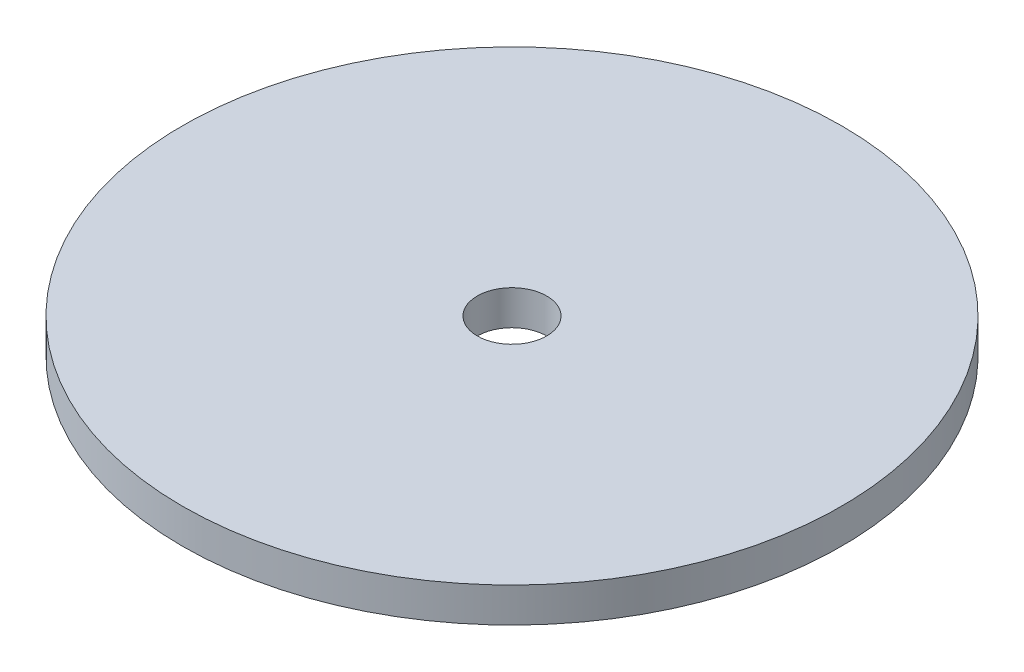
ISO-10303-21;
HEADER;
FILE_DESCRIPTION(('STEP AP214'),'2;1');
FILE_NAME('part.step','',(''),(''),'','','');
FILE_SCHEMA(('AUTOMOTIVE_DESIGN { 1 0 10303 214 1 1 1 1 }'));
ENDSEC;
DATA;
#1=APPLICATION_CONTEXT('core data for automotive mechanical design processes');
#2=APPLICATION_PROTOCOL_DEFINITION('international standard','automotive_design',2000,#1);
#3=PRODUCT_CONTEXT('',#1,'mechanical');
#4=PRODUCT('Part','Part','',(#3));
#5=PRODUCT_RELATED_PRODUCT_CATEGORY('part','',(#4));
#6=PRODUCT_DEFINITION_FORMATION('','',#4);
#7=PRODUCT_DEFINITION_CONTEXT('part definition',#1,'design');
#8=PRODUCT_DEFINITION('design','',#6,#7);
#9=PRODUCT_DEFINITION_SHAPE('','',#8);
#10=(LENGTH_UNIT() NAMED_UNIT(*) SI_UNIT(.MILLI.,.METRE.));
#11=(NAMED_UNIT(*) PLANE_ANGLE_UNIT() SI_UNIT($,.RADIAN.));
#12=(NAMED_UNIT(*) SI_UNIT($,.STERADIAN.) SOLID_ANGLE_UNIT());
#13=UNCERTAINTY_MEASURE_WITH_UNIT(LENGTH_MEASURE(1.E-05),#10,'distance_accuracy_value','');
#14=(GEOMETRIC_REPRESENTATION_CONTEXT(3) GLOBAL_UNCERTAINTY_ASSIGNED_CONTEXT((#13)) GLOBAL_UNIT_ASSIGNED_CONTEXT((#10,
#11,#12)) REPRESENTATION_CONTEXT('',''));
#15=CARTESIAN_POINT('',(0.,0.,0.));
#16=DIRECTION('',(0.,0.,1.));
#17=DIRECTION('',(1.,0.,0.));
#18=AXIS2_PLACEMENT_3D('',#15,#16,#17);
#19=CARTESIAN_POINT('',(0.,5.,0.));
#20=DIRECTION('',(0.,-1.,0.));
#21=DIRECTION('',(0.,0.,-1.));
#22=AXIS2_PLACEMENT_3D('',#19,#20,#21);
#23=CYLINDRICAL_SURFACE('',#22,47.5);
#24=CARTESIAN_POINT('',(0.,5.,0.));
#25=DIRECTION('',(0.,1.,0.));
#26=DIRECTION('',(0.,0.,1.));
#27=AXIS2_PLACEMENT_3D('',#24,#25,#26);
#28=CIRCLE('',#27,47.5);
#29=CARTESIAN_POINT('',(0.,5.,47.5));
#30=VERTEX_POINT('',#29);
#31=EDGE_CURVE('E10',#30,#30,#28,.T.);
#32=ORIENTED_EDGE('',*,*,#31,.F.);
#33=EDGE_LOOP('',(#32));
#34=FACE_BOUND('',#33,.T.);
#35=CARTESIAN_POINT('',(0.,0.,0.));
#36=DIRECTION('',(0.,1.,0.));
#37=DIRECTION('',(0.,0.,1.));
#38=AXIS2_PLACEMENT_3D('',#35,#36,#37);
#39=CIRCLE('',#38,47.5);
#40=CARTESIAN_POINT('',(0.,0.,47.5));
#41=VERTEX_POINT('',#40);
#42=EDGE_CURVE('E40',#41,#41,#39,.T.);
#43=ORIENTED_EDGE('',*,*,#42,.T.);
#44=EDGE_LOOP('',(#43));
#45=FACE_BOUND('',#44,.T.);
#46=ADVANCED_FACE('F37',(#34,#45),#23,.T.);
#47=CARTESIAN_POINT('',(0.,5.,0.));
#48=DIRECTION('',(0.,1.,0.));
#49=DIRECTION('',(0.,0.,1.));
#50=AXIS2_PLACEMENT_3D('',#47,#48,#49);
#51=PLANE('',#50);
#52=CARTESIAN_POINT('',(0.,5.,0.));
#53=DIRECTION('',(0.,1.,0.));
#54=DIRECTION('',(0.,0.,1.));
#55=AXIS2_PLACEMENT_3D('',#52,#53,#54);
#56=CIRCLE('',#55,5.);
#57=CARTESIAN_POINT('',(0.,5.,5.));
#58=VERTEX_POINT('',#57);
#59=EDGE_CURVE('E49',#58,#58,#56,.T.);
#60=ORIENTED_EDGE('',*,*,#59,.F.);
#61=EDGE_LOOP('',(#60));
#62=FACE_BOUND('',#61,.T.);
#63=ORIENTED_EDGE('',*,*,#31,.T.);
#64=EDGE_LOOP('',(#63));
#65=FACE_BOUND('',#64,.T.);
#66=ADVANCED_FACE('F64',(#62,#65),#51,.T.);
#67=CARTESIAN_POINT('',(0.,0.,0.));
#68=DIRECTION('',(0.,1.,0.));
#69=DIRECTION('',(0.,0.,1.));
#70=AXIS2_PLACEMENT_3D('',#67,#68,#69);
#71=PLANE('',#70);
#72=CARTESIAN_POINT('',(0.,0.,0.));
#73=DIRECTION('',(0.,1.,0.));
#74=DIRECTION('',(0.,0.,1.));
#75=AXIS2_PLACEMENT_3D('',#72,#73,#74);
#76=CIRCLE('',#75,5.);
#77=CARTESIAN_POINT('',(0.,0.,5.));
#78=VERTEX_POINT('',#77);
#79=EDGE_CURVE('E47',#78,#78,#76,.T.);
#80=ORIENTED_EDGE('',*,*,#79,.T.);
#81=EDGE_LOOP('',(#80));
#82=FACE_BOUND('',#81,.T.);
#83=ORIENTED_EDGE('',*,*,#42,.F.);
#84=EDGE_LOOP('',(#83));
#85=FACE_BOUND('',#84,.T.);
#86=ADVANCED_FACE('F55',(#82,#85),#71,.F.);
#87=CARTESIAN_POINT('',(0.,0.,0.));
#88=DIRECTION('',(0.,1.,0.));
#89=DIRECTION('',(0.,0.,1.));
#90=AXIS2_PLACEMENT_3D('',#87,#88,#89);
#91=CYLINDRICAL_SURFACE('',#90,5.);
#92=ORIENTED_EDGE('',*,*,#79,.F.);
#93=EDGE_LOOP('',(#92));
#94=FACE_BOUND('',#93,.T.);
#95=ORIENTED_EDGE('',*,*,#59,.T.);
#96=EDGE_LOOP('',(#95));
#97=FACE_BOUND('',#96,.T.);
#98=ADVANCED_FACE('F58',(#94,#97),#91,.F.);
#99=CLOSED_SHELL('',(#46,#66,#86,#98));
#100=MANIFOLD_SOLID_BREP('B2',#99);
#101=ADVANCED_BREP_SHAPE_REPRESENTATION('',(#18,#100),#14);
#102=SHAPE_DEFINITION_REPRESENTATION(#9,#101);
ENDSEC;
END-ISO-10303-21;
